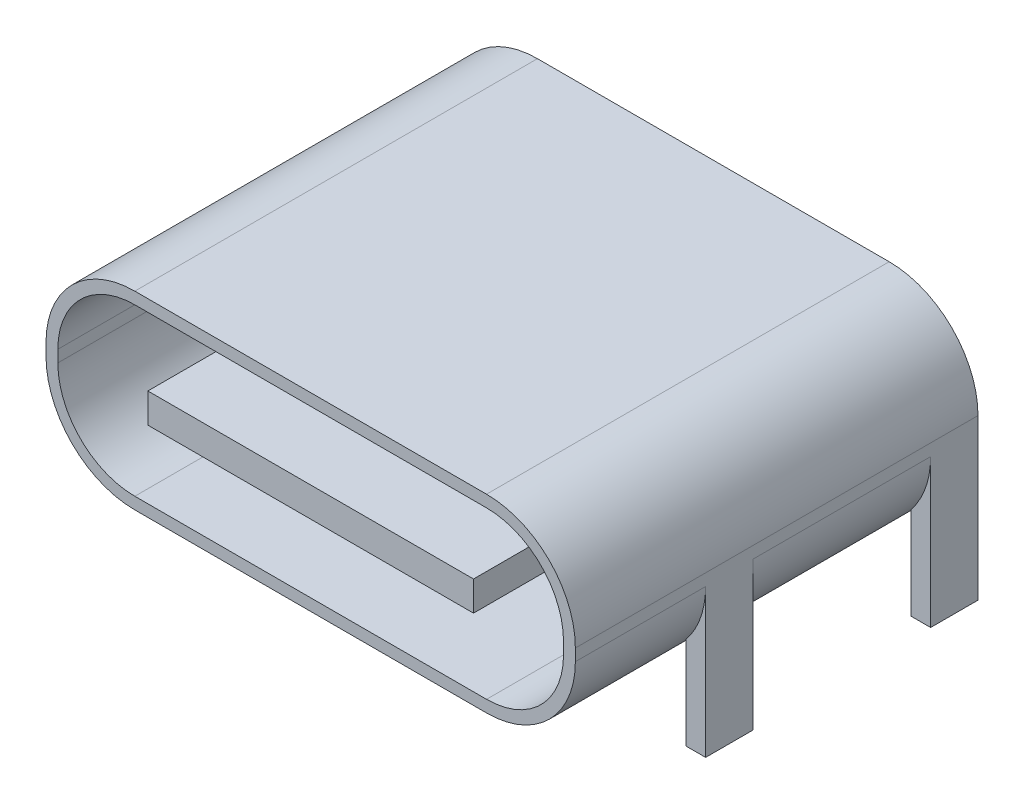
ISO-10303-21;
HEADER;
FILE_DESCRIPTION(('STEP AP214'),'2;1');
FILE_NAME('part.step','',(''),(''),'','','');
FILE_SCHEMA(('AUTOMOTIVE_DESIGN { 1 0 10303 214 1 1 1 1 }'));
ENDSEC;
DATA;
#1=APPLICATION_CONTEXT('core data for automotive mechanical design processes');
#2=APPLICATION_PROTOCOL_DEFINITION('international standard','automotive_design',2000,#1);
#3=PRODUCT_CONTEXT('',#1,'mechanical');
#4=PRODUCT('Part','Part','',(#3));
#5=PRODUCT_RELATED_PRODUCT_CATEGORY('part','',(#4));
#6=PRODUCT_DEFINITION_FORMATION('','',#4);
#7=PRODUCT_DEFINITION_CONTEXT('part definition',#1,'design');
#8=PRODUCT_DEFINITION('design','',#6,#7);
#9=PRODUCT_DEFINITION_SHAPE('','',#8);
#10=(LENGTH_UNIT() NAMED_UNIT(*) SI_UNIT(.MILLI.,.METRE.));
#11=(NAMED_UNIT(*) PLANE_ANGLE_UNIT() SI_UNIT($,.RADIAN.));
#12=(NAMED_UNIT(*) SI_UNIT($,.STERADIAN.) SOLID_ANGLE_UNIT());
#13=UNCERTAINTY_MEASURE_WITH_UNIT(LENGTH_MEASURE(1.E-05),#10,'distance_accuracy_value','');
#14=(GEOMETRIC_REPRESENTATION_CONTEXT(3) GLOBAL_UNCERTAINTY_ASSIGNED_CONTEXT((#13)) GLOBAL_UNIT_ASSIGNED_CONTEXT((#10,
#11,#12)) REPRESENTATION_CONTEXT('',''));
#15=CARTESIAN_POINT('',(0.,0.,0.));
#16=DIRECTION('',(0.,0.,1.));
#17=DIRECTION('',(1.,0.,0.));
#18=AXIS2_PLACEMENT_3D('',#15,#16,#17);
#19=CARTESIAN_POINT('',(2.97,-0.1,6.8));
#20=DIRECTION('',(0.,0.,-1.));
#21=DIRECTION('',(-1.,0.,0.));
#22=AXIS2_PLACEMENT_3D('',#19,#20,#21);
#23=CYLINDRICAL_SURFACE('',#22,1.5);
#24=CARTESIAN_POINT('',(2.97,-0.1,3.8));
#25=DIRECTION('',(0.,0.,-1.));
#26=DIRECTION('',(-1.,0.,0.));
#27=AXIS2_PLACEMENT_3D('',#24,#25,#26);
#28=CIRCLE('',#27,1.5);
#29=CARTESIAN_POINT('',(4.13488532402459,-1.0450090908939,3.8));
#30=VERTEX_POINT('',#29);
#31=CARTESIAN_POINT('',(4.47,-0.0999999999999999,3.8));
#32=VERTEX_POINT('',#31);
#33=EDGE_CURVE('E380',#30,#32,#28,.F.);
#34=ORIENTED_EDGE('',*,*,#33,.F.);
#35=DIRECTION('',(0.,0.,-1.));
#36=VECTOR('',#35,1.);
#37=CARTESIAN_POINT('',(4.13488532402459,-1.0450090908939,6.8));
#38=LINE('',#37,#36);
#39=CARTESIAN_POINT('',(4.13488532402459,-1.0450090908939,4.6));
#40=VERTEX_POINT('',#39);
#41=EDGE_CURVE('E379',#40,#30,#38,.T.);
#42=ORIENTED_EDGE('',*,*,#41,.F.);
#43=CARTESIAN_POINT('',(2.97,-0.1,4.6));
#44=DIRECTION('',(0.,0.,1.));
#45=DIRECTION('',(1.,0.,0.));
#46=AXIS2_PLACEMENT_3D('',#43,#44,#45);
#47=CIRCLE('',#46,1.5);
#48=CARTESIAN_POINT('',(4.47,-0.1,4.6));
#49=VERTEX_POINT('',#48);
#50=EDGE_CURVE('E382',#49,#40,#47,.F.);
#51=ORIENTED_EDGE('',*,*,#50,.F.);
#52=DIRECTION('',(0.,0.,-1.));
#53=VECTOR('',#52,1.);
#54=CARTESIAN_POINT('',(4.47,-0.0999999999999999,6.8));
#55=LINE('',#54,#53);
#56=CARTESIAN_POINT('',(4.47,-0.0999999999999999,6.8));
#57=VERTEX_POINT('',#56);
#58=EDGE_CURVE('E515',#57,#49,#55,.T.);
#59=ORIENTED_EDGE('',*,*,#58,.F.);
#60=CARTESIAN_POINT('',(2.97,-0.1,6.8));
#61=DIRECTION('',(0.,0.,1.));
#62=DIRECTION('',(1.,0.,0.));
#63=AXIS2_PLACEMENT_3D('',#60,#61,#62);
#64=CIRCLE('',#63,1.5);
#65=CARTESIAN_POINT('',(2.97,-1.6,6.8));
#66=VERTEX_POINT('',#65);
#67=EDGE_CURVE('E473',#66,#57,#64,.T.);
#68=ORIENTED_EDGE('',*,*,#67,.F.);
#69=DIRECTION('',(0.,0.,-1.));
#70=VECTOR('',#69,1.);
#71=CARTESIAN_POINT('',(2.97,-1.6,6.8));
#72=LINE('',#71,#70);
#73=CARTESIAN_POINT('',(2.97,-1.6,0.));
#74=VERTEX_POINT('',#73);
#75=EDGE_CURVE('E45',#66,#74,#72,.T.);
#76=ORIENTED_EDGE('',*,*,#75,.T.);
#77=CARTESIAN_POINT('',(2.97,-0.1,0.));
#78=DIRECTION('',(0.,0.,1.));
#79=DIRECTION('',(1.,0.,0.));
#80=AXIS2_PLACEMENT_3D('',#77,#78,#79);
#81=CIRCLE('',#80,1.5);
#82=CARTESIAN_POINT('',(4.13488532402459,-1.0450090908939,0.));
#83=VERTEX_POINT('',#82);
#84=EDGE_CURVE('E489',#74,#83,#81,.T.);
#85=ORIENTED_EDGE('',*,*,#84,.T.);
#86=DIRECTION('',(0.,0.,-1.));
#87=VECTOR('',#86,1.);
#88=CARTESIAN_POINT('',(4.13488532402459,-1.0450090908939,6.8));
#89=LINE('',#88,#87);
#90=CARTESIAN_POINT('',(4.13488532402459,-1.0450090908939,0.8));
#91=VERTEX_POINT('',#90);
#92=EDGE_CURVE('E406',#91,#83,#89,.T.);
#93=ORIENTED_EDGE('',*,*,#92,.F.);
#94=CARTESIAN_POINT('',(2.97,-0.1,0.8));
#95=DIRECTION('',(0.,0.,1.));
#96=DIRECTION('',(1.,0.,0.));
#97=AXIS2_PLACEMENT_3D('',#94,#95,#96);
#98=CIRCLE('',#97,1.5);
#99=CARTESIAN_POINT('',(4.47,-0.0999999999999999,0.8));
#100=VERTEX_POINT('',#99);
#101=EDGE_CURVE('E409',#100,#91,#98,.F.);
#102=ORIENTED_EDGE('',*,*,#101,.F.);
#103=EDGE_CURVE('E514',#32,#100,#55,.T.);
#104=ORIENTED_EDGE('',*,*,#103,.F.);
#105=EDGE_LOOP('',(#34,#42,#51,#59,#68,#76,#85,#93,#102,#104));
#106=FACE_BOUND('',#105,.T.);
#107=ADVANCED_FACE('F37',(#106),#23,.T.);
#108=CARTESIAN_POINT('',(-2.97,-0.1,6.8));
#109=DIRECTION('',(0.,0.,-1.));
#110=DIRECTION('',(-1.,0.,0.));
#111=AXIS2_PLACEMENT_3D('',#108,#109,#110);
#112=CYLINDRICAL_SURFACE('',#111,1.5);
#113=DIRECTION('',(0.,0.,-1.));
#114=VECTOR('',#113,1.);
#115=CARTESIAN_POINT('',(-4.13488532402459,-1.0450090908939,6.8));
#116=LINE('',#115,#114);
#117=CARTESIAN_POINT('',(-4.13488532402459,-1.0450090908939,0.));
#118=VERTEX_POINT('',#117);
#119=CARTESIAN_POINT('',(-4.13488532402459,-1.0450090908939,0.800000000000001));
#120=VERTEX_POINT('',#119);
#121=EDGE_CURVE('E430',#118,#120,#116,.F.);
#122=ORIENTED_EDGE('',*,*,#121,.F.);
#123=CARTESIAN_POINT('',(-2.97,-0.1,0.));
#124=DIRECTION('',(0.,0.,1.));
#125=DIRECTION('',(1.,0.,0.));
#126=AXIS2_PLACEMENT_3D('',#123,#124,#125);
#127=CIRCLE('',#126,1.5);
#128=CARTESIAN_POINT('',(-2.97,-1.6,0.));
#129=VERTEX_POINT('',#128);
#130=EDGE_CURVE('E466',#118,#129,#127,.T.);
#131=ORIENTED_EDGE('',*,*,#130,.T.);
#132=DIRECTION('',(0.,0.,-1.));
#133=VECTOR('',#132,1.);
#134=CARTESIAN_POINT('',(-2.97,-1.6,6.8));
#135=LINE('',#134,#133);
#136=CARTESIAN_POINT('',(-2.97,-1.6,6.8));
#137=VERTEX_POINT('',#136);
#138=EDGE_CURVE('E11',#137,#129,#135,.T.);
#139=ORIENTED_EDGE('',*,*,#138,.F.);
#140=CARTESIAN_POINT('',(-2.97,-0.1,6.8));
#141=DIRECTION('',(0.,0.,1.));
#142=DIRECTION('',(1.,0.,0.));
#143=AXIS2_PLACEMENT_3D('',#140,#141,#142);
#144=CIRCLE('',#143,1.5);
#145=CARTESIAN_POINT('',(-4.47,-0.1,6.8));
#146=VERTEX_POINT('',#145);
#147=EDGE_CURVE('E467',#146,#137,#144,.T.);
#148=ORIENTED_EDGE('',*,*,#147,.F.);
#149=DIRECTION('',(0.,0.,-1.));
#150=VECTOR('',#149,1.);
#151=CARTESIAN_POINT('',(-4.47,-0.1,6.8));
#152=LINE('',#151,#150);
#153=CARTESIAN_POINT('',(-4.47,-0.1,4.6));
#154=VERTEX_POINT('',#153);
#155=EDGE_CURVE('E500',#146,#154,#152,.T.);
#156=ORIENTED_EDGE('',*,*,#155,.T.);
#157=CARTESIAN_POINT('',(-2.97,-0.1,4.6));
#158=DIRECTION('',(0.,0.,1.));
#159=DIRECTION('',(1.,0.,0.));
#160=AXIS2_PLACEMENT_3D('',#157,#158,#159);
#161=CIRCLE('',#160,1.5);
#162=CARTESIAN_POINT('',(-4.13488532402459,-1.0450090908939,4.6));
#163=VERTEX_POINT('',#162);
#164=EDGE_CURVE('E436',#163,#154,#161,.F.);
#165=ORIENTED_EDGE('',*,*,#164,.F.);
#166=DIRECTION('',(0.,0.,-1.));
#167=VECTOR('',#166,1.);
#168=CARTESIAN_POINT('',(-4.13488532402459,-1.0450090908939,6.8));
#169=LINE('',#168,#167);
#170=CARTESIAN_POINT('',(-4.13488532402459,-1.0450090908939,3.8));
#171=VERTEX_POINT('',#170);
#172=EDGE_CURVE('E439',#171,#163,#169,.F.);
#173=ORIENTED_EDGE('',*,*,#172,.F.);
#174=CARTESIAN_POINT('',(-2.97,-0.1,3.8));
#175=DIRECTION('',(0.,0.,-1.));
#176=DIRECTION('',(-1.,0.,0.));
#177=AXIS2_PLACEMENT_3D('',#174,#175,#176);
#178=CIRCLE('',#177,1.5);
#179=CARTESIAN_POINT('',(-4.47,-0.1,3.8));
#180=VERTEX_POINT('',#179);
#181=EDGE_CURVE('E442',#180,#171,#178,.F.);
#182=ORIENTED_EDGE('',*,*,#181,.F.);
#183=CARTESIAN_POINT('',(-4.47,-0.1,0.800000000000001));
#184=VERTEX_POINT('',#183);
#185=EDGE_CURVE('E485',#180,#184,#152,.T.);
#186=ORIENTED_EDGE('',*,*,#185,.T.);
#187=CARTESIAN_POINT('',(-2.97,-0.1,0.800000000000001));
#188=DIRECTION('',(0.,0.,1.));
#189=DIRECTION('',(1.,0.,0.));
#190=AXIS2_PLACEMENT_3D('',#187,#188,#189);
#191=CIRCLE('',#190,1.5);
#192=EDGE_CURVE('E433',#120,#184,#191,.F.);
#193=ORIENTED_EDGE('',*,*,#192,.F.);
#194=EDGE_LOOP('',(#122,#131,#139,#148,#156,#165,#173,#182,#186,#193));
#195=FACE_BOUND('',#194,.T.);
#196=ADVANCED_FACE('F39',(#195),#112,.T.);
#197=CARTESIAN_POINT('',(-2.97,-1.6,6.8));
#198=DIRECTION('',(0.,1.,0.));
#199=DIRECTION('',(0.,0.,1.));
#200=AXIS2_PLACEMENT_3D('',#197,#198,#199);
#201=PLANE('',#200);
#202=DIRECTION('',(1.,0.,0.));
#203=VECTOR('',#202,1.);
#204=CARTESIAN_POINT('',(-2.97,-1.6,0.));
#205=LINE('',#204,#203);
#206=EDGE_CURVE('E487',#129,#74,#205,.T.);
#207=ORIENTED_EDGE('',*,*,#206,.T.);
#208=ORIENTED_EDGE('',*,*,#75,.F.);
#209=DIRECTION('',(1.,0.,0.));
#210=VECTOR('',#209,1.);
#211=CARTESIAN_POINT('',(-2.97,-1.6,6.8));
#212=LINE('',#211,#210);
#213=EDGE_CURVE('E470',#137,#66,#212,.T.);
#214=ORIENTED_EDGE('',*,*,#213,.F.);
#215=ORIENTED_EDGE('',*,*,#138,.T.);
#216=EDGE_LOOP('',(#207,#208,#214,#215));
#217=FACE_BOUND('',#216,.T.);
#218=ADVANCED_FACE('F565',(#217),#201,.F.);
#219=CARTESIAN_POINT('',(4.47,0.1,6.8));
#220=DIRECTION('',(-1.,0.,0.));
#221=DIRECTION('',(0.,-1.,0.));
#222=AXIS2_PLACEMENT_3D('',#219,#220,#221);
#223=PLANE('',#222);
#224=DIRECTION('',(0.,1.,0.));
#225=VECTOR('',#224,1.);
#226=CARTESIAN_POINT('',(4.47,0.1,0.));
#227=LINE('',#226,#225);
#228=CARTESIAN_POINT('',(4.47,-2.6,0.));
#229=VERTEX_POINT('',#228);
#230=CARTESIAN_POINT('',(4.47,0.1,0.));
#231=VERTEX_POINT('',#230);
#232=EDGE_CURVE('E491',#229,#231,#227,.T.);
#233=ORIENTED_EDGE('',*,*,#232,.T.);
#234=DIRECTION('',(0.,0.,-1.));
#235=VECTOR('',#234,1.);
#236=CARTESIAN_POINT('',(4.47,0.1,6.8));
#237=LINE('',#236,#235);
#238=CARTESIAN_POINT('',(4.47,0.1,6.8));
#239=VERTEX_POINT('',#238);
#240=EDGE_CURVE('E511',#239,#231,#237,.T.);
#241=ORIENTED_EDGE('',*,*,#240,.F.);
#242=DIRECTION('',(0.,1.,0.));
#243=VECTOR('',#242,1.);
#244=CARTESIAN_POINT('',(4.47,0.1,6.8));
#245=LINE('',#244,#243);
#246=EDGE_CURVE('E475',#57,#239,#245,.T.);
#247=ORIENTED_EDGE('',*,*,#246,.F.);
#248=ORIENTED_EDGE('',*,*,#58,.T.);
#249=DIRECTION('',(0.,1.,0.));
#250=VECTOR('',#249,1.);
#251=CARTESIAN_POINT('',(4.47,-2.6,4.6));
#252=LINE('',#251,#250);
#253=CARTESIAN_POINT('',(4.47,-2.6,4.6));
#254=VERTEX_POINT('',#253);
#255=EDGE_CURVE('E366',#254,#49,#252,.T.);
#256=ORIENTED_EDGE('',*,*,#255,.F.);
#257=DIRECTION('',(0.,0.,1.));
#258=VECTOR('',#257,1.);
#259=CARTESIAN_POINT('',(4.47,-2.6,4.6));
#260=LINE('',#259,#258);
#261=CARTESIAN_POINT('',(4.47,-2.6,3.8));
#262=VERTEX_POINT('',#261);
#263=EDGE_CURVE('E372',#262,#254,#260,.T.);
#264=ORIENTED_EDGE('',*,*,#263,.F.);
#265=DIRECTION('',(0.,1.,0.));
#266=VECTOR('',#265,1.);
#267=CARTESIAN_POINT('',(4.47,-2.6,3.8));
#268=LINE('',#267,#266);
#269=EDGE_CURVE('E363',#262,#32,#268,.T.);
#270=ORIENTED_EDGE('',*,*,#269,.T.);
#271=ORIENTED_EDGE('',*,*,#103,.T.);
#272=DIRECTION('',(0.,1.,0.));
#273=VECTOR('',#272,1.);
#274=CARTESIAN_POINT('',(4.47,-2.6,0.8));
#275=LINE('',#274,#273);
#276=CARTESIAN_POINT('',(4.47,-2.6,0.8));
#277=VERTEX_POINT('',#276);
#278=EDGE_CURVE('E390',#277,#100,#275,.T.);
#279=ORIENTED_EDGE('',*,*,#278,.F.);
#280=DIRECTION('',(0.,0.,1.));
#281=VECTOR('',#280,1.);
#282=CARTESIAN_POINT('',(4.47,-2.6,0.8));
#283=LINE('',#282,#281);
#284=EDGE_CURVE('E398',#229,#277,#283,.T.);
#285=ORIENTED_EDGE('',*,*,#284,.F.);
#286=EDGE_LOOP('',(#233,#241,#247,#248,#256,#264,#270,#271,#279,#285));
#287=FACE_BOUND('',#286,.T.);
#288=ADVANCED_FACE('F541',(#287),#223,.F.);
#289=CARTESIAN_POINT('',(2.97,0.1,6.8));
#290=DIRECTION('',(0.,0.,-1.));
#291=DIRECTION('',(-1.,0.,0.));
#292=AXIS2_PLACEMENT_3D('',#289,#290,#291);
#293=CYLINDRICAL_SURFACE('',#292,1.5);
#294=CARTESIAN_POINT('',(2.97,0.1,0.));
#295=DIRECTION('',(0.,0.,1.));
#296=DIRECTION('',(-1.,0.,0.));
#297=AXIS2_PLACEMENT_3D('',#294,#295,#296);
#298=CIRCLE('',#297,1.5);
#299=CARTESIAN_POINT('',(2.97,1.6,0.));
#300=VERTEX_POINT('',#299);
#301=EDGE_CURVE('E493',#231,#300,#298,.T.);
#302=ORIENTED_EDGE('',*,*,#301,.T.);
#303=DIRECTION('',(0.,0.,-1.));
#304=VECTOR('',#303,1.);
#305=CARTESIAN_POINT('',(2.97,1.6,6.8));
#306=LINE('',#305,#304);
#307=CARTESIAN_POINT('',(2.97,1.6,6.8));
#308=VERTEX_POINT('',#307);
#309=EDGE_CURVE('E508',#308,#300,#306,.T.);
#310=ORIENTED_EDGE('',*,*,#309,.F.);
#311=CARTESIAN_POINT('',(2.97,0.1,6.8));
#312=DIRECTION('',(0.,0.,1.));
#313=DIRECTION('',(-1.,0.,0.));
#314=AXIS2_PLACEMENT_3D('',#311,#312,#313);
#315=CIRCLE('',#314,1.5);
#316=EDGE_CURVE('E477',#239,#308,#315,.T.);
#317=ORIENTED_EDGE('',*,*,#316,.F.);
#318=ORIENTED_EDGE('',*,*,#240,.T.);
#319=EDGE_LOOP('',(#302,#310,#317,#318));
#320=FACE_BOUND('',#319,.T.);
#321=ADVANCED_FACE('F595',(#320),#293,.T.);
#322=CARTESIAN_POINT('',(-2.97,1.6,6.8));
#323=DIRECTION('',(0.,-1.,0.));
#324=DIRECTION('',(0.,0.,-1.));
#325=AXIS2_PLACEMENT_3D('',#322,#323,#324);
#326=PLANE('',#325);
#327=DIRECTION('',(-1.,0.,0.));
#328=VECTOR('',#327,1.);
#329=CARTESIAN_POINT('',(-2.97,1.6,0.));
#330=LINE('',#329,#328);
#331=CARTESIAN_POINT('',(-2.97,1.6,0.));
#332=VERTEX_POINT('',#331);
#333=EDGE_CURVE('E495',#300,#332,#330,.T.);
#334=ORIENTED_EDGE('',*,*,#333,.T.);
#335=DIRECTION('',(0.,0.,-1.));
#336=VECTOR('',#335,1.);
#337=CARTESIAN_POINT('',(-2.97,1.6,6.8));
#338=LINE('',#337,#336);
#339=CARTESIAN_POINT('',(-2.97,1.6,6.8));
#340=VERTEX_POINT('',#339);
#341=EDGE_CURVE('E505',#340,#332,#338,.T.);
#342=ORIENTED_EDGE('',*,*,#341,.F.);
#343=DIRECTION('',(-1.,0.,0.));
#344=VECTOR('',#343,1.);
#345=CARTESIAN_POINT('',(-2.97,1.6,6.8));
#346=LINE('',#345,#344);
#347=EDGE_CURVE('E479',#308,#340,#346,.T.);
#348=ORIENTED_EDGE('',*,*,#347,.F.);
#349=ORIENTED_EDGE('',*,*,#309,.T.);
#350=EDGE_LOOP('',(#334,#342,#348,#349));
#351=FACE_BOUND('',#350,.T.);
#352=ADVANCED_FACE('F593',(#351),#326,.F.);
#353=CARTESIAN_POINT('',(-2.97,0.1,6.8));
#354=DIRECTION('',(0.,0.,-1.));
#355=DIRECTION('',(-1.,0.,0.));
#356=AXIS2_PLACEMENT_3D('',#353,#354,#355);
#357=CYLINDRICAL_SURFACE('',#356,1.5);
#358=CARTESIAN_POINT('',(-2.97,0.1,0.));
#359=DIRECTION('',(0.,0.,1.));
#360=DIRECTION('',(1.,0.,0.));
#361=AXIS2_PLACEMENT_3D('',#358,#359,#360);
#362=CIRCLE('',#361,1.5);
#363=CARTESIAN_POINT('',(-4.47,0.0999999999999999,0.));
#364=VERTEX_POINT('',#363);
#365=EDGE_CURVE('E497',#332,#364,#362,.T.);
#366=ORIENTED_EDGE('',*,*,#365,.T.);
#367=DIRECTION('',(0.,0.,-1.));
#368=VECTOR('',#367,1.);
#369=CARTESIAN_POINT('',(-4.47,0.0999999999999999,6.8));
#370=LINE('',#369,#368);
#371=CARTESIAN_POINT('',(-4.47,0.0999999999999999,6.8));
#372=VERTEX_POINT('',#371);
#373=EDGE_CURVE('E502',#372,#364,#370,.T.);
#374=ORIENTED_EDGE('',*,*,#373,.F.);
#375=CARTESIAN_POINT('',(-2.97,0.1,6.8));
#376=DIRECTION('',(0.,0.,1.));
#377=DIRECTION('',(1.,0.,0.));
#378=AXIS2_PLACEMENT_3D('',#375,#376,#377);
#379=CIRCLE('',#378,1.5);
#380=EDGE_CURVE('E481',#340,#372,#379,.T.);
#381=ORIENTED_EDGE('',*,*,#380,.F.);
#382=ORIENTED_EDGE('',*,*,#341,.T.);
#383=EDGE_LOOP('',(#366,#374,#381,#382));
#384=FACE_BOUND('',#383,.T.);
#385=ADVANCED_FACE('F588',(#384),#357,.T.);
#386=CARTESIAN_POINT('',(-4.47,0.0999999999999999,6.8));
#387=DIRECTION('',(1.,0.,0.));
#388=DIRECTION('',(0.,0.,-1.));
#389=AXIS2_PLACEMENT_3D('',#386,#387,#388);
#390=PLANE('',#389);
#391=DIRECTION('',(0.,-1.,0.));
#392=VECTOR('',#391,1.);
#393=CARTESIAN_POINT('',(-4.47,0.0999999999999999,0.));
#394=LINE('',#393,#392);
#395=CARTESIAN_POINT('',(-4.47,-2.6,0.));
#396=VERTEX_POINT('',#395);
#397=EDGE_CURVE('E471',#364,#396,#394,.T.);
#398=ORIENTED_EDGE('',*,*,#397,.T.);
#399=DIRECTION('',(0.,0.,-1.));
#400=VECTOR('',#399,1.);
#401=CARTESIAN_POINT('',(-4.47,-2.6,0.8));
#402=LINE('',#401,#400);
#403=CARTESIAN_POINT('',(-4.47,-2.6,0.8));
#404=VERTEX_POINT('',#403);
#405=EDGE_CURVE('E427',#404,#396,#402,.T.);
#406=ORIENTED_EDGE('',*,*,#405,.F.);
#407=DIRECTION('',(0.,1.,0.));
#408=VECTOR('',#407,1.);
#409=CARTESIAN_POINT('',(-4.47,-2.6,0.8));
#410=LINE('',#409,#408);
#411=EDGE_CURVE('E418',#404,#184,#410,.T.);
#412=ORIENTED_EDGE('',*,*,#411,.T.);
#413=ORIENTED_EDGE('',*,*,#185,.F.);
#414=DIRECTION('',(0.,1.,0.));
#415=VECTOR('',#414,1.);
#416=CARTESIAN_POINT('',(-4.47,-2.6,3.8));
#417=LINE('',#416,#415);
#418=CARTESIAN_POINT('',(-4.47,-2.6,3.8));
#419=VERTEX_POINT('',#418);
#420=EDGE_CURVE('E463',#419,#180,#417,.T.);
#421=ORIENTED_EDGE('',*,*,#420,.F.);
#422=DIRECTION('',(0.,0.,-1.));
#423=VECTOR('',#422,1.);
#424=CARTESIAN_POINT('',(-4.47,-2.6,4.6));
#425=LINE('',#424,#423);
#426=CARTESIAN_POINT('',(-4.47,-2.6,4.6));
#427=VERTEX_POINT('',#426);
#428=EDGE_CURVE('E445',#427,#419,#425,.T.);
#429=ORIENTED_EDGE('',*,*,#428,.F.);
#430=DIRECTION('',(0.,1.,0.));
#431=VECTOR('',#430,1.);
#432=CARTESIAN_POINT('',(-4.47,-2.6,4.6));
#433=LINE('',#432,#431);
#434=EDGE_CURVE('E454',#427,#154,#433,.T.);
#435=ORIENTED_EDGE('',*,*,#434,.T.);
#436=ORIENTED_EDGE('',*,*,#155,.F.);
#437=DIRECTION('',(0.,-1.,0.));
#438=VECTOR('',#437,1.);
#439=CARTESIAN_POINT('',(-4.47,0.0999999999999999,6.8));
#440=LINE('',#439,#438);
#441=EDGE_CURVE('E483',#372,#146,#440,.T.);
#442=ORIENTED_EDGE('',*,*,#441,.F.);
#443=ORIENTED_EDGE('',*,*,#373,.T.);
#444=EDGE_LOOP('',(#398,#406,#412,#413,#421,#429,#435,#436,#442,#443));
#445=FACE_BOUND('',#444,.T.);
#446=ADVANCED_FACE('F581',(#445),#390,.F.);
#447=CARTESIAN_POINT('',(-2.97,-0.1,6.8));
#448=DIRECTION('',(0.,0.,1.));
#449=DIRECTION('',(1.,0.,0.));
#450=AXIS2_PLACEMENT_3D('',#447,#448,#449);
#451=PLANE('',#450);
#452=CARTESIAN_POINT('',(-2.97,-0.1,6.8));
#453=DIRECTION('',(0.,0.,1.));
#454=DIRECTION('',(1.,0.,0.));
#455=AXIS2_PLACEMENT_3D('',#452,#453,#454);
#456=CIRCLE('',#455,1.3);
#457=CARTESIAN_POINT('',(-4.27,-0.1,6.8));
#458=VERTEX_POINT('',#457);
#459=CARTESIAN_POINT('',(-2.97,-1.4,6.8));
#460=VERTEX_POINT('',#459);
#461=EDGE_CURVE('E52',#458,#460,#456,.T.);
#462=ORIENTED_EDGE('',*,*,#461,.F.);
#463=DIRECTION('',(0.,-1.,0.));
#464=VECTOR('',#463,1.);
#465=CARTESIAN_POINT('',(-4.27,0.1,6.8));
#466=LINE('',#465,#464);
#467=CARTESIAN_POINT('',(-4.27,0.1,6.8));
#468=VERTEX_POINT('',#467);
#469=EDGE_CURVE('E303',#468,#458,#466,.T.);
#470=ORIENTED_EDGE('',*,*,#469,.F.);
#471=CARTESIAN_POINT('',(-2.97,0.1,6.8));
#472=DIRECTION('',(0.,0.,1.));
#473=DIRECTION('',(1.,0.,0.));
#474=AXIS2_PLACEMENT_3D('',#471,#472,#473);
#475=CIRCLE('',#474,1.3);
#476=CARTESIAN_POINT('',(-2.97,1.4,6.8));
#477=VERTEX_POINT('',#476);
#478=EDGE_CURVE('E341',#477,#468,#475,.T.);
#479=ORIENTED_EDGE('',*,*,#478,.F.);
#480=DIRECTION('',(-1.,0.,0.));
#481=VECTOR('',#480,1.);
#482=CARTESIAN_POINT('',(2.97,1.4,6.8));
#483=LINE('',#482,#481);
#484=CARTESIAN_POINT('',(2.97,1.4,6.8));
#485=VERTEX_POINT('',#484);
#486=EDGE_CURVE('E338',#485,#477,#483,.T.);
#487=ORIENTED_EDGE('',*,*,#486,.F.);
#488=CARTESIAN_POINT('',(2.97,0.1,6.8));
#489=DIRECTION('',(0.,0.,1.));
#490=DIRECTION('',(1.,0.,0.));
#491=AXIS2_PLACEMENT_3D('',#488,#489,#490);
#492=CIRCLE('',#491,1.3);
#493=CARTESIAN_POINT('',(4.27,0.0999999999999994,6.8));
#494=VERTEX_POINT('',#493);
#495=EDGE_CURVE('E335',#494,#485,#492,.T.);
#496=ORIENTED_EDGE('',*,*,#495,.F.);
#497=DIRECTION('',(0.,1.,0.));
#498=VECTOR('',#497,1.);
#499=CARTESIAN_POINT('',(4.27,-0.1,6.8));
#500=LINE('',#499,#498);
#501=CARTESIAN_POINT('',(4.27,-0.1,6.8));
#502=VERTEX_POINT('',#501);
#503=EDGE_CURVE('E332',#502,#494,#500,.T.);
#504=ORIENTED_EDGE('',*,*,#503,.F.);
#505=CARTESIAN_POINT('',(2.97,-0.1,6.8));
#506=DIRECTION('',(0.,0.,1.));
#507=DIRECTION('',(1.,0.,0.));
#508=AXIS2_PLACEMENT_3D('',#505,#506,#507);
#509=CIRCLE('',#508,1.3);
#510=CARTESIAN_POINT('',(2.97,-1.4,6.8));
#511=VERTEX_POINT('',#510);
#512=EDGE_CURVE('E329',#511,#502,#509,.T.);
#513=ORIENTED_EDGE('',*,*,#512,.F.);
#514=DIRECTION('',(1.,0.,0.));
#515=VECTOR('',#514,1.);
#516=CARTESIAN_POINT('',(-2.97,-1.4,6.8));
#517=LINE('',#516,#515);
#518=EDGE_CURVE('E326',#460,#511,#517,.T.);
#519=ORIENTED_EDGE('',*,*,#518,.F.);
#520=EDGE_LOOP('',(#462,#470,#479,#487,#496,#504,#513,#519));
#521=FACE_BOUND('',#520,.T.);
#522=ORIENTED_EDGE('',*,*,#147,.T.);
#523=ORIENTED_EDGE('',*,*,#213,.T.);
#524=ORIENTED_EDGE('',*,*,#67,.T.);
#525=ORIENTED_EDGE('',*,*,#246,.T.);
#526=ORIENTED_EDGE('',*,*,#316,.T.);
#527=ORIENTED_EDGE('',*,*,#347,.T.);
#528=ORIENTED_EDGE('',*,*,#380,.T.);
#529=ORIENTED_EDGE('',*,*,#441,.T.);
#530=EDGE_LOOP('',(#522,#523,#524,#525,#526,#527,#528,#529));
#531=FACE_BOUND('',#530,.T.);
#532=ADVANCED_FACE('F561',(#521,#531),#451,.T.);
#533=CARTESIAN_POINT('',(-2.97,-0.1,0.));
#534=DIRECTION('',(0.,0.,1.));
#535=DIRECTION('',(1.,0.,0.));
#536=AXIS2_PLACEMENT_3D('',#533,#534,#535);
#537=PLANE('',#536);
#538=ORIENTED_EDGE('',*,*,#130,.F.);
#539=DIRECTION('',(0.,1.,0.));
#540=VECTOR('',#539,1.);
#541=CARTESIAN_POINT('',(-4.13488532402459,-2.6,0.));
#542=LINE('',#541,#540);
#543=CARTESIAN_POINT('',(-4.13488532402459,-2.6,0.));
#544=VERTEX_POINT('',#543);
#545=EDGE_CURVE('E412',#544,#118,#542,.T.);
#546=ORIENTED_EDGE('',*,*,#545,.F.);
#547=DIRECTION('',(1.,0.,0.));
#548=VECTOR('',#547,1.);
#549=CARTESIAN_POINT('',(-4.47,-2.6,0.));
#550=LINE('',#549,#548);
#551=EDGE_CURVE('E425',#396,#544,#550,.T.);
#552=ORIENTED_EDGE('',*,*,#551,.F.);
#553=ORIENTED_EDGE('',*,*,#397,.F.);
#554=ORIENTED_EDGE('',*,*,#365,.F.);
#555=ORIENTED_EDGE('',*,*,#333,.F.);
#556=ORIENTED_EDGE('',*,*,#301,.F.);
#557=ORIENTED_EDGE('',*,*,#232,.F.);
#558=DIRECTION('',(1.,0.,0.));
#559=VECTOR('',#558,1.);
#560=CARTESIAN_POINT('',(4.13488532402459,-2.6,0.));
#561=LINE('',#560,#559);
#562=CARTESIAN_POINT('',(4.13488532402459,-2.6,0.));
#563=VERTEX_POINT('',#562);
#564=EDGE_CURVE('E400',#563,#229,#561,.T.);
#565=ORIENTED_EDGE('',*,*,#564,.F.);
#566=DIRECTION('',(0.,1.,0.));
#567=VECTOR('',#566,1.);
#568=CARTESIAN_POINT('',(4.13488532402459,-2.6,0.));
#569=LINE('',#568,#567);
#570=EDGE_CURVE('E387',#563,#83,#569,.T.);
#571=ORIENTED_EDGE('',*,*,#570,.T.);
#572=ORIENTED_EDGE('',*,*,#84,.F.);
#573=ORIENTED_EDGE('',*,*,#206,.F.);
#574=EDGE_LOOP('',(#538,#546,#552,#553,#554,#555,#556,#557,#565,#571,#572,#573));
#575=FACE_BOUND('',#574,.T.);
#576=ADVANCED_FACE('F527',(#575),#537,.F.);
#577=CARTESIAN_POINT('',(-4.47,-2.6,3.8));
#578=DIRECTION('',(0.,0.,1.));
#579=DIRECTION('',(1.,0.,0.));
#580=AXIS2_PLACEMENT_3D('',#577,#578,#579);
#581=PLANE('',#580);
#582=ORIENTED_EDGE('',*,*,#420,.T.);
#583=ORIENTED_EDGE('',*,*,#181,.T.);
#584=DIRECTION('',(0.,1.,0.));
#585=VECTOR('',#584,1.);
#586=CARTESIAN_POINT('',(-4.13488532402459,-2.6,3.8));
#587=LINE('',#586,#585);
#588=CARTESIAN_POINT('',(-4.13488532402459,-2.6,3.8));
#589=VERTEX_POINT('',#588);
#590=EDGE_CURVE('E460',#589,#171,#587,.T.);
#591=ORIENTED_EDGE('',*,*,#590,.F.);
#592=DIRECTION('',(1.,0.,0.));
#593=VECTOR('',#592,1.);
#594=CARTESIAN_POINT('',(-4.47,-2.6,3.8));
#595=LINE('',#594,#593);
#596=EDGE_CURVE('E448',#419,#589,#595,.T.);
#597=ORIENTED_EDGE('',*,*,#596,.F.);
#598=EDGE_LOOP('',(#582,#583,#591,#597));
#599=FACE_BOUND('',#598,.T.);
#600=ADVANCED_FACE('F632',(#599),#581,.F.);
#601=CARTESIAN_POINT('',(-4.13488532402459,-2.6,4.6));
#602=DIRECTION('',(-1.,0.,0.));
#603=DIRECTION('',(0.,0.,1.));
#604=AXIS2_PLACEMENT_3D('',#601,#602,#603);
#605=PLANE('',#604);
#606=ORIENTED_EDGE('',*,*,#590,.T.);
#607=ORIENTED_EDGE('',*,*,#172,.T.);
#608=DIRECTION('',(0.,1.,0.));
#609=VECTOR('',#608,1.);
#610=CARTESIAN_POINT('',(-4.13488532402459,-2.6,4.6));
#611=LINE('',#610,#609);
#612=CARTESIAN_POINT('',(-4.13488532402459,-2.6,4.6));
#613=VERTEX_POINT('',#612);
#614=EDGE_CURVE('E457',#613,#163,#611,.T.);
#615=ORIENTED_EDGE('',*,*,#614,.F.);
#616=DIRECTION('',(0.,0.,1.));
#617=VECTOR('',#616,1.);
#618=CARTESIAN_POINT('',(-4.13488532402459,-2.6,4.6));
#619=LINE('',#618,#617);
#620=EDGE_CURVE('E450',#589,#613,#619,.T.);
#621=ORIENTED_EDGE('',*,*,#620,.F.);
#622=EDGE_LOOP('',(#606,#607,#615,#621));
#623=FACE_BOUND('',#622,.T.);
#624=ADVANCED_FACE('F639',(#623),#605,.F.);
#625=CARTESIAN_POINT('',(-4.47,-2.6,4.6));
#626=DIRECTION('',(0.,0.,-1.));
#627=DIRECTION('',(-1.,0.,0.));
#628=AXIS2_PLACEMENT_3D('',#625,#626,#627);
#629=PLANE('',#628);
#630=ORIENTED_EDGE('',*,*,#614,.T.);
#631=ORIENTED_EDGE('',*,*,#164,.T.);
#632=ORIENTED_EDGE('',*,*,#434,.F.);
#633=DIRECTION('',(-1.,0.,0.));
#634=VECTOR('',#633,1.);
#635=CARTESIAN_POINT('',(-4.47,-2.6,4.6));
#636=LINE('',#635,#634);
#637=EDGE_CURVE('E452',#613,#427,#636,.T.);
#638=ORIENTED_EDGE('',*,*,#637,.F.);
#639=EDGE_LOOP('',(#630,#631,#632,#638));
#640=FACE_BOUND('',#639,.T.);
#641=ADVANCED_FACE('F643',(#640),#629,.F.);
#642=CARTESIAN_POINT('',(0.,-2.6,0.));
#643=DIRECTION('',(0.,-1.,0.));
#644=DIRECTION('',(0.,0.,-1.));
#645=AXIS2_PLACEMENT_3D('',#642,#643,#644);
#646=PLANE('',#645);
#647=ORIENTED_EDGE('',*,*,#428,.T.);
#648=ORIENTED_EDGE('',*,*,#596,.T.);
#649=ORIENTED_EDGE('',*,*,#620,.T.);
#650=ORIENTED_EDGE('',*,*,#637,.T.);
#651=EDGE_LOOP('',(#647,#648,#649,#650));
#652=FACE_BOUND('',#651,.T.);
#653=ADVANCED_FACE('F647',(#652),#646,.T.);
#654=CARTESIAN_POINT('',(-4.13488532402459,-2.6,0.8));
#655=DIRECTION('',(-1.,0.,0.));
#656=DIRECTION('',(0.,0.,1.));
#657=AXIS2_PLACEMENT_3D('',#654,#655,#656);
#658=PLANE('',#657);
#659=ORIENTED_EDGE('',*,*,#545,.T.);
#660=ORIENTED_EDGE('',*,*,#121,.T.);
#661=DIRECTION('',(0.,1.,0.));
#662=VECTOR('',#661,1.);
#663=CARTESIAN_POINT('',(-4.13488532402459,-2.6,0.8));
#664=LINE('',#663,#662);
#665=CARTESIAN_POINT('',(-4.13488532402459,-2.6,0.8));
#666=VERTEX_POINT('',#665);
#667=EDGE_CURVE('E415',#666,#120,#664,.T.);
#668=ORIENTED_EDGE('',*,*,#667,.F.);
#669=DIRECTION('',(0.,0.,1.));
#670=VECTOR('',#669,1.);
#671=CARTESIAN_POINT('',(-4.13488532402459,-2.6,0.8));
#672=LINE('',#671,#670);
#673=EDGE_CURVE('E423',#544,#666,#672,.T.);
#674=ORIENTED_EDGE('',*,*,#673,.F.);
#675=EDGE_LOOP('',(#659,#660,#668,#674));
#676=FACE_BOUND('',#675,.T.);
#677=ADVANCED_FACE('F574',(#676),#658,.F.);
#678=CARTESIAN_POINT('',(-4.47,-2.6,0.8));
#679=DIRECTION('',(0.,0.,-1.));
#680=DIRECTION('',(-1.,0.,0.));
#681=AXIS2_PLACEMENT_3D('',#678,#679,#680);
#682=PLANE('',#681);
#683=ORIENTED_EDGE('',*,*,#667,.T.);
#684=ORIENTED_EDGE('',*,*,#192,.T.);
#685=ORIENTED_EDGE('',*,*,#411,.F.);
#686=DIRECTION('',(-1.,0.,0.));
#687=VECTOR('',#686,1.);
#688=CARTESIAN_POINT('',(-4.47,-2.6,0.8));
#689=LINE('',#688,#687);
#690=EDGE_CURVE('E421',#666,#404,#689,.T.);
#691=ORIENTED_EDGE('',*,*,#690,.F.);
#692=EDGE_LOOP('',(#683,#684,#685,#691));
#693=FACE_BOUND('',#692,.T.);
#694=ADVANCED_FACE('F654',(#693),#682,.F.);
#695=CARTESIAN_POINT('',(0.,-2.6,0.));
#696=DIRECTION('',(0.,-1.,0.));
#697=DIRECTION('',(0.,0.,-1.));
#698=AXIS2_PLACEMENT_3D('',#695,#696,#697);
#699=PLANE('',#698);
#700=ORIENTED_EDGE('',*,*,#405,.T.);
#701=ORIENTED_EDGE('',*,*,#551,.T.);
#702=ORIENTED_EDGE('',*,*,#673,.T.);
#703=ORIENTED_EDGE('',*,*,#690,.T.);
#704=EDGE_LOOP('',(#700,#701,#702,#703));
#705=FACE_BOUND('',#704,.T.);
#706=ADVANCED_FACE('F577',(#705),#699,.T.);
#707=CARTESIAN_POINT('',(4.13488532402459,-2.6,0.8));
#708=DIRECTION('',(1.,0.,0.));
#709=DIRECTION('',(0.,0.,-1.));
#710=AXIS2_PLACEMENT_3D('',#707,#708,#709);
#711=PLANE('',#710);
#712=DIRECTION('',(0.,1.,0.));
#713=VECTOR('',#712,1.);
#714=CARTESIAN_POINT('',(4.13488532402459,-2.6,0.8));
#715=LINE('',#714,#713);
#716=CARTESIAN_POINT('',(4.13488532402459,-2.6,0.8));
#717=VERTEX_POINT('',#716);
#718=EDGE_CURVE('E393',#717,#91,#715,.T.);
#719=ORIENTED_EDGE('',*,*,#718,.T.);
#720=ORIENTED_EDGE('',*,*,#92,.T.);
#721=ORIENTED_EDGE('',*,*,#570,.F.);
#722=DIRECTION('',(0.,0.,-1.));
#723=VECTOR('',#722,1.);
#724=CARTESIAN_POINT('',(4.13488532402459,-2.6,0.8));
#725=LINE('',#724,#723);
#726=EDGE_CURVE('E403',#717,#563,#725,.T.);
#727=ORIENTED_EDGE('',*,*,#726,.F.);
#728=EDGE_LOOP('',(#719,#720,#721,#727));
#729=FACE_BOUND('',#728,.T.);
#730=ADVANCED_FACE('F531',(#729),#711,.F.);
#731=CARTESIAN_POINT('',(4.13488532402459,-2.6,0.8));
#732=DIRECTION('',(0.,0.,-1.));
#733=DIRECTION('',(-1.,0.,0.));
#734=AXIS2_PLACEMENT_3D('',#731,#732,#733);
#735=PLANE('',#734);
#736=ORIENTED_EDGE('',*,*,#278,.T.);
#737=ORIENTED_EDGE('',*,*,#101,.T.);
#738=ORIENTED_EDGE('',*,*,#718,.F.);
#739=DIRECTION('',(-1.,0.,0.));
#740=VECTOR('',#739,1.);
#741=CARTESIAN_POINT('',(4.13488532402459,-2.6,0.8));
#742=LINE('',#741,#740);
#743=EDGE_CURVE('E396',#277,#717,#742,.T.);
#744=ORIENTED_EDGE('',*,*,#743,.F.);
#745=EDGE_LOOP('',(#736,#737,#738,#744));
#746=FACE_BOUND('',#745,.T.);
#747=ADVANCED_FACE('F538',(#746),#735,.F.);
#748=CARTESIAN_POINT('',(0.,-2.6,0.));
#749=DIRECTION('',(0.,-1.,0.));
#750=DIRECTION('',(0.,0.,-1.));
#751=AXIS2_PLACEMENT_3D('',#748,#749,#750);
#752=PLANE('',#751);
#753=ORIENTED_EDGE('',*,*,#726,.T.);
#754=ORIENTED_EDGE('',*,*,#564,.T.);
#755=ORIENTED_EDGE('',*,*,#284,.T.);
#756=ORIENTED_EDGE('',*,*,#743,.T.);
#757=EDGE_LOOP('',(#753,#754,#755,#756));
#758=FACE_BOUND('',#757,.T.);
#759=ADVANCED_FACE('F597',(#758),#752,.T.);
#760=CARTESIAN_POINT('',(4.13488532402459,-2.6,4.6));
#761=DIRECTION('',(1.,0.,0.));
#762=DIRECTION('',(0.,0.,-1.));
#763=AXIS2_PLACEMENT_3D('',#760,#761,#762);
#764=PLANE('',#763);
#765=DIRECTION('',(0.,1.,0.));
#766=VECTOR('',#765,1.);
#767=CARTESIAN_POINT('',(4.13488532402459,-2.6,4.6));
#768=LINE('',#767,#766);
#769=CARTESIAN_POINT('',(4.13488532402459,-2.6,4.6));
#770=VERTEX_POINT('',#769);
#771=EDGE_CURVE('E368',#770,#40,#768,.T.);
#772=ORIENTED_EDGE('',*,*,#771,.T.);
#773=ORIENTED_EDGE('',*,*,#41,.T.);
#774=DIRECTION('',(0.,1.,0.));
#775=VECTOR('',#774,1.);
#776=CARTESIAN_POINT('',(4.13488532402459,-2.6,3.8));
#777=LINE('',#776,#775);
#778=CARTESIAN_POINT('',(4.13488532402459,-2.6,3.8));
#779=VERTEX_POINT('',#778);
#780=EDGE_CURVE('E348',#779,#30,#777,.T.);
#781=ORIENTED_EDGE('',*,*,#780,.F.);
#782=DIRECTION('',(0.,0.,-1.));
#783=VECTOR('',#782,1.);
#784=CARTESIAN_POINT('',(4.13488532402459,-2.6,4.6));
#785=LINE('',#784,#783);
#786=EDGE_CURVE('E376',#770,#779,#785,.T.);
#787=ORIENTED_EDGE('',*,*,#786,.F.);
#788=EDGE_LOOP('',(#772,#773,#781,#787));
#789=FACE_BOUND('',#788,.T.);
#790=ADVANCED_FACE('F551',(#789),#764,.F.);
#791=CARTESIAN_POINT('',(4.13488532402459,-2.6,3.8));
#792=DIRECTION('',(0.,0.,1.));
#793=DIRECTION('',(1.,0.,0.));
#794=AXIS2_PLACEMENT_3D('',#791,#792,#793);
#795=PLANE('',#794);
#796=ORIENTED_EDGE('',*,*,#780,.T.);
#797=ORIENTED_EDGE('',*,*,#33,.T.);
#798=ORIENTED_EDGE('',*,*,#269,.F.);
#799=DIRECTION('',(1.,0.,0.));
#800=VECTOR('',#799,1.);
#801=CARTESIAN_POINT('',(4.13488532402459,-2.6,3.8));
#802=LINE('',#801,#800);
#803=EDGE_CURVE('E374',#779,#262,#802,.T.);
#804=ORIENTED_EDGE('',*,*,#803,.F.);
#805=EDGE_LOOP('',(#796,#797,#798,#804));
#806=FACE_BOUND('',#805,.T.);
#807=ADVANCED_FACE('F546',(#806),#795,.F.);
#808=CARTESIAN_POINT('',(4.13488532402459,-2.6,4.6));
#809=DIRECTION('',(0.,0.,-1.));
#810=DIRECTION('',(-1.,0.,0.));
#811=AXIS2_PLACEMENT_3D('',#808,#809,#810);
#812=PLANE('',#811);
#813=ORIENTED_EDGE('',*,*,#255,.T.);
#814=ORIENTED_EDGE('',*,*,#50,.T.);
#815=ORIENTED_EDGE('',*,*,#771,.F.);
#816=DIRECTION('',(-1.,0.,0.));
#817=VECTOR('',#816,1.);
#818=CARTESIAN_POINT('',(4.13488532402459,-2.6,4.6));
#819=LINE('',#818,#817);
#820=EDGE_CURVE('E370',#254,#770,#819,.T.);
#821=ORIENTED_EDGE('',*,*,#820,.F.);
#822=EDGE_LOOP('',(#813,#814,#815,#821));
#823=FACE_BOUND('',#822,.T.);
#824=ADVANCED_FACE('F556',(#823),#812,.F.);
#825=CARTESIAN_POINT('',(0.,-2.6,0.));
#826=DIRECTION('',(0.,-1.,0.));
#827=DIRECTION('',(0.,0.,-1.));
#828=AXIS2_PLACEMENT_3D('',#825,#826,#827);
#829=PLANE('',#828);
#830=ORIENTED_EDGE('',*,*,#786,.T.);
#831=ORIENTED_EDGE('',*,*,#803,.T.);
#832=ORIENTED_EDGE('',*,*,#263,.T.);
#833=ORIENTED_EDGE('',*,*,#820,.T.);
#834=EDGE_LOOP('',(#830,#831,#832,#833));
#835=FACE_BOUND('',#834,.T.);
#836=ADVANCED_FACE('F711',(#835),#829,.T.);
#837=CARTESIAN_POINT('',(-2.97,-0.1,1.8));
#838=DIRECTION('',(0.,0.,1.));
#839=DIRECTION('',(1.,0.,0.));
#840=AXIS2_PLACEMENT_3D('',#837,#838,#839);
#841=CYLINDRICAL_SURFACE('',#840,1.3);
#842=ORIENTED_EDGE('',*,*,#461,.T.);
#843=DIRECTION('',(0.,0.,1.));
#844=VECTOR('',#843,1.);
#845=CARTESIAN_POINT('',(-2.97,-1.4,1.8));
#846=LINE('',#845,#844);
#847=CARTESIAN_POINT('',(-2.97,-1.4,1.8));
#848=VERTEX_POINT('',#847);
#849=EDGE_CURVE('E324',#848,#460,#846,.T.);
#850=ORIENTED_EDGE('',*,*,#849,.F.);
#851=CARTESIAN_POINT('',(-2.97,-0.1,1.8));
#852=DIRECTION('',(0.,0.,1.));
#853=DIRECTION('',(1.,0.,0.));
#854=AXIS2_PLACEMENT_3D('',#851,#852,#853);
#855=CIRCLE('',#854,1.3);
#856=CARTESIAN_POINT('',(-4.27,-0.1,1.8));
#857=VERTEX_POINT('',#856);
#858=EDGE_CURVE('E299',#857,#848,#855,.T.);
#859=ORIENTED_EDGE('',*,*,#858,.F.);
#860=DIRECTION('',(0.,0.,1.));
#861=VECTOR('',#860,1.);
#862=CARTESIAN_POINT('',(-4.27,-0.1,1.8));
#863=LINE('',#862,#861);
#864=EDGE_CURVE('E346',#857,#458,#863,.T.);
#865=ORIENTED_EDGE('',*,*,#864,.T.);
#866=EDGE_LOOP('',(#842,#850,#859,#865));
#867=FACE_BOUND('',#866,.T.);
#868=ADVANCED_FACE('F721',(#867),#841,.F.);
#869=CARTESIAN_POINT('',(-4.27,0.1,1.8));
#870=DIRECTION('',(-1.,0.,0.));
#871=DIRECTION('',(0.,0.,1.));
#872=AXIS2_PLACEMENT_3D('',#869,#870,#871);
#873=PLANE('',#872);
#874=ORIENTED_EDGE('',*,*,#469,.T.);
#875=ORIENTED_EDGE('',*,*,#864,.F.);
#876=DIRECTION('',(0.,-1.,0.));
#877=VECTOR('',#876,1.);
#878=CARTESIAN_POINT('',(-4.27,0.1,1.8));
#879=LINE('',#878,#877);
#880=CARTESIAN_POINT('',(-4.27,0.1,1.8));
#881=VERTEX_POINT('',#880);
#882=EDGE_CURVE('E321',#881,#857,#879,.T.);
#883=ORIENTED_EDGE('',*,*,#882,.F.);
#884=DIRECTION('',(0.,0.,1.));
#885=VECTOR('',#884,1.);
#886=CARTESIAN_POINT('',(-4.27,0.1,1.8));
#887=LINE('',#886,#885);
#888=EDGE_CURVE('E349',#881,#468,#887,.T.);
#889=ORIENTED_EDGE('',*,*,#888,.T.);
#890=EDGE_LOOP('',(#874,#875,#883,#889));
#891=FACE_BOUND('',#890,.T.);
#892=ADVANCED_FACE('F742',(#891),#873,.F.);
#893=CARTESIAN_POINT('',(-2.97,0.1,1.8));
#894=DIRECTION('',(0.,0.,1.));
#895=DIRECTION('',(1.,0.,0.));
#896=AXIS2_PLACEMENT_3D('',#893,#894,#895);
#897=CYLINDRICAL_SURFACE('',#896,1.3);
#898=ORIENTED_EDGE('',*,*,#478,.T.);
#899=ORIENTED_EDGE('',*,*,#888,.F.);
#900=CARTESIAN_POINT('',(-2.97,0.1,1.8));
#901=DIRECTION('',(0.,0.,1.));
#902=DIRECTION('',(1.,0.,0.));
#903=AXIS2_PLACEMENT_3D('',#900,#901,#902);
#904=CIRCLE('',#903,1.3);
#905=CARTESIAN_POINT('',(-2.97,1.4,1.8));
#906=VERTEX_POINT('',#905);
#907=EDGE_CURVE('E318',#906,#881,#904,.T.);
#908=ORIENTED_EDGE('',*,*,#907,.F.);
#909=DIRECTION('',(0.,0.,1.));
#910=VECTOR('',#909,1.);
#911=CARTESIAN_POINT('',(-2.97,1.4,1.8));
#912=LINE('',#911,#910);
#913=EDGE_CURVE('E351',#906,#477,#912,.T.);
#914=ORIENTED_EDGE('',*,*,#913,.T.);
#915=EDGE_LOOP('',(#898,#899,#908,#914));
#916=FACE_BOUND('',#915,.T.);
#917=ADVANCED_FACE('F752',(#916),#897,.F.);
#918=CARTESIAN_POINT('',(2.97,1.4,1.8));
#919=DIRECTION('',(0.,1.,0.));
#920=DIRECTION('',(-1.,0.,0.));
#921=AXIS2_PLACEMENT_3D('',#918,#919,#920);
#922=PLANE('',#921);
#923=ORIENTED_EDGE('',*,*,#486,.T.);
#924=ORIENTED_EDGE('',*,*,#913,.F.);
#925=DIRECTION('',(-1.,0.,0.));
#926=VECTOR('',#925,1.);
#927=CARTESIAN_POINT('',(2.97,1.4,1.8));
#928=LINE('',#927,#926);
#929=CARTESIAN_POINT('',(2.97,1.4,1.8));
#930=VERTEX_POINT('',#929);
#931=EDGE_CURVE('E315',#930,#906,#928,.T.);
#932=ORIENTED_EDGE('',*,*,#931,.F.);
#933=DIRECTION('',(0.,0.,1.));
#934=VECTOR('',#933,1.);
#935=CARTESIAN_POINT('',(2.97,1.4,1.8));
#936=LINE('',#935,#934);
#937=EDGE_CURVE('E353',#930,#485,#936,.T.);
#938=ORIENTED_EDGE('',*,*,#937,.T.);
#939=EDGE_LOOP('',(#923,#924,#932,#938));
#940=FACE_BOUND('',#939,.T.);
#941=ADVANCED_FACE('F763',(#940),#922,.F.);
#942=CARTESIAN_POINT('',(2.97,0.1,1.8));
#943=DIRECTION('',(0.,0.,1.));
#944=DIRECTION('',(1.,0.,0.));
#945=AXIS2_PLACEMENT_3D('',#942,#943,#944);
#946=CYLINDRICAL_SURFACE('',#945,1.3);
#947=ORIENTED_EDGE('',*,*,#495,.T.);
#948=ORIENTED_EDGE('',*,*,#937,.F.);
#949=CARTESIAN_POINT('',(2.97,0.1,1.8));
#950=DIRECTION('',(0.,0.,1.));
#951=DIRECTION('',(1.,0.,0.));
#952=AXIS2_PLACEMENT_3D('',#949,#950,#951);
#953=CIRCLE('',#952,1.3);
#954=CARTESIAN_POINT('',(4.27,0.0999999999999994,1.8));
#955=VERTEX_POINT('',#954);
#956=EDGE_CURVE('E312',#955,#930,#953,.T.);
#957=ORIENTED_EDGE('',*,*,#956,.F.);
#958=DIRECTION('',(0.,0.,1.));
#959=VECTOR('',#958,1.);
#960=CARTESIAN_POINT('',(4.27,0.0999999999999994,1.8));
#961=LINE('',#960,#959);
#962=EDGE_CURVE('E355',#955,#494,#961,.T.);
#963=ORIENTED_EDGE('',*,*,#962,.T.);
#964=EDGE_LOOP('',(#947,#948,#957,#963));
#965=FACE_BOUND('',#964,.T.);
#966=ADVANCED_FACE('F774',(#965),#946,.F.);
#967=CARTESIAN_POINT('',(4.27,-0.1,1.8));
#968=DIRECTION('',(1.,0.,0.));
#969=DIRECTION('',(0.,1.,0.));
#970=AXIS2_PLACEMENT_3D('',#967,#968,#969);
#971=PLANE('',#970);
#972=ORIENTED_EDGE('',*,*,#503,.T.);
#973=ORIENTED_EDGE('',*,*,#962,.F.);
#974=DIRECTION('',(0.,1.,0.));
#975=VECTOR('',#974,1.);
#976=CARTESIAN_POINT('',(4.27,-0.1,1.8));
#977=LINE('',#976,#975);
#978=CARTESIAN_POINT('',(4.27,-0.1,1.8));
#979=VERTEX_POINT('',#978);
#980=EDGE_CURVE('E309',#979,#955,#977,.T.);
#981=ORIENTED_EDGE('',*,*,#980,.F.);
#982=DIRECTION('',(0.,0.,1.));
#983=VECTOR('',#982,1.);
#984=CARTESIAN_POINT('',(4.27,-0.1,1.8));
#985=LINE('',#984,#983);
#986=EDGE_CURVE('E357',#979,#502,#985,.T.);
#987=ORIENTED_EDGE('',*,*,#986,.T.);
#988=EDGE_LOOP('',(#972,#973,#981,#987));
#989=FACE_BOUND('',#988,.T.);
#990=ADVANCED_FACE('F785',(#989),#971,.F.);
#991=CARTESIAN_POINT('',(2.97,-0.1,1.8));
#992=DIRECTION('',(0.,0.,1.));
#993=DIRECTION('',(1.,0.,0.));
#994=AXIS2_PLACEMENT_3D('',#991,#992,#993);
#995=CYLINDRICAL_SURFACE('',#994,1.3);
#996=ORIENTED_EDGE('',*,*,#512,.T.);
#997=ORIENTED_EDGE('',*,*,#986,.F.);
#998=CARTESIAN_POINT('',(2.97,-0.1,1.8));
#999=DIRECTION('',(0.,0.,1.));
#1000=DIRECTION('',(1.,0.,0.));
#1001=AXIS2_PLACEMENT_3D('',#998,#999,#1000);
#1002=CIRCLE('',#1001,1.3);
#1003=CARTESIAN_POINT('',(2.97,-1.4,1.8));
#1004=VERTEX_POINT('',#1003);
#1005=EDGE_CURVE('E306',#1004,#979,#1002,.T.);
#1006=ORIENTED_EDGE('',*,*,#1005,.F.);
#1007=DIRECTION('',(0.,0.,1.));
#1008=VECTOR('',#1007,1.);
#1009=CARTESIAN_POINT('',(2.97,-1.4,1.8));
#1010=LINE('',#1009,#1008);
#1011=EDGE_CURVE('E359',#1004,#511,#1010,.T.);
#1012=ORIENTED_EDGE('',*,*,#1011,.T.);
#1013=EDGE_LOOP('',(#996,#997,#1006,#1012));
#1014=FACE_BOUND('',#1013,.T.);
#1015=ADVANCED_FACE('F796',(#1014),#995,.F.);
#1016=CARTESIAN_POINT('',(-2.97,-1.4,1.8));
#1017=DIRECTION('',(0.,-1.,0.));
#1018=DIRECTION('',(0.,0.,-1.));
#1019=AXIS2_PLACEMENT_3D('',#1016,#1017,#1018);
#1020=PLANE('',#1019);
#1021=ORIENTED_EDGE('',*,*,#518,.T.);
#1022=ORIENTED_EDGE('',*,*,#1011,.F.);
#1023=DIRECTION('',(1.,0.,0.));
#1024=VECTOR('',#1023,1.);
#1025=CARTESIAN_POINT('',(-2.97,-1.4,1.8));
#1026=LINE('',#1025,#1024);
#1027=EDGE_CURVE('E302',#848,#1004,#1026,.T.);
#1028=ORIENTED_EDGE('',*,*,#1027,.F.);
#1029=ORIENTED_EDGE('',*,*,#849,.T.);
#1030=EDGE_LOOP('',(#1021,#1022,#1028,#1029));
#1031=FACE_BOUND('',#1030,.T.);
#1032=ADVANCED_FACE('F807',(#1031),#1020,.F.);
#1033=CARTESIAN_POINT('',(-2.97,-0.1,1.8));
#1034=DIRECTION('',(0.,0.,1.));
#1035=DIRECTION('',(1.,0.,0.));
#1036=AXIS2_PLACEMENT_3D('',#1033,#1034,#1035);
#1037=PLANE('',#1036);
#1038=DIRECTION('',(1.,0.,0.));
#1039=VECTOR('',#1038,1.);
#1040=CARTESIAN_POINT('',(-2.75,-0.25,1.8));
#1041=LINE('',#1040,#1039);
#1042=CARTESIAN_POINT('',(-2.75,-0.25,1.8));
#1043=VERTEX_POINT('',#1042);
#1044=CARTESIAN_POINT('',(2.75,-0.25,1.8));
#1045=VERTEX_POINT('',#1044);
#1046=EDGE_CURVE('E270',#1043,#1045,#1041,.T.);
#1047=ORIENTED_EDGE('',*,*,#1046,.F.);
#1048=DIRECTION('',(0.,-1.,0.));
#1049=VECTOR('',#1048,1.);
#1050=CARTESIAN_POINT('',(-2.75,0.25,1.8));
#1051=LINE('',#1050,#1049);
#1052=CARTESIAN_POINT('',(-2.75,0.25,1.8));
#1053=VERTEX_POINT('',#1052);
#1054=EDGE_CURVE('E280',#1053,#1043,#1051,.T.);
#1055=ORIENTED_EDGE('',*,*,#1054,.F.);
#1056=DIRECTION('',(-1.,0.,0.));
#1057=VECTOR('',#1056,1.);
#1058=CARTESIAN_POINT('',(-2.75,0.25,1.8));
#1059=LINE('',#1058,#1057);
#1060=CARTESIAN_POINT('',(2.75,0.25,1.8));
#1061=VERTEX_POINT('',#1060);
#1062=EDGE_CURVE('E262',#1061,#1053,#1059,.T.);
#1063=ORIENTED_EDGE('',*,*,#1062,.F.);
#1064=DIRECTION('',(0.,1.,0.));
#1065=VECTOR('',#1064,1.);
#1066=CARTESIAN_POINT('',(2.75,0.25,1.8));
#1067=LINE('',#1066,#1065);
#1068=EDGE_CURVE('E277',#1045,#1061,#1067,.T.);
#1069=ORIENTED_EDGE('',*,*,#1068,.F.);
#1070=EDGE_LOOP('',(#1047,#1055,#1063,#1069));
#1071=FACE_BOUND('',#1070,.T.);
#1072=ORIENTED_EDGE('',*,*,#858,.T.);
#1073=ORIENTED_EDGE('',*,*,#1027,.T.);
#1074=ORIENTED_EDGE('',*,*,#1005,.T.);
#1075=ORIENTED_EDGE('',*,*,#980,.T.);
#1076=ORIENTED_EDGE('',*,*,#956,.T.);
#1077=ORIENTED_EDGE('',*,*,#931,.T.);
#1078=ORIENTED_EDGE('',*,*,#907,.T.);
#1079=ORIENTED_EDGE('',*,*,#882,.T.);
#1080=EDGE_LOOP('',(#1072,#1073,#1074,#1075,#1076,#1077,#1078,#1079));
#1081=FACE_BOUND('',#1080,.T.);
#1082=ADVANCED_FACE('F275',(#1071,#1081),#1037,.T.);
#1083=CARTESIAN_POINT('',(2.75,0.25,1.8));
#1084=DIRECTION('',(1.,0.,0.));
#1085=DIRECTION('',(0.,0.,-1.));
#1086=AXIS2_PLACEMENT_3D('',#1083,#1084,#1085);
#1087=PLANE('',#1086);
#1088=DIRECTION('',(0.,1.,0.));
#1089=VECTOR('',#1088,1.);
#1090=CARTESIAN_POINT('',(2.75,0.25,6.8));
#1091=LINE('',#1090,#1089);
#1092=CARTESIAN_POINT('',(2.75,-0.25,6.8));
#1093=VERTEX_POINT('',#1092);
#1094=CARTESIAN_POINT('',(2.75,0.25,6.8));
#1095=VERTEX_POINT('',#1094);
#1096=EDGE_CURVE('E291',#1093,#1095,#1091,.T.);
#1097=ORIENTED_EDGE('',*,*,#1096,.F.);
#1098=DIRECTION('',(0.,0.,1.));
#1099=VECTOR('',#1098,1.);
#1100=CARTESIAN_POINT('',(2.75,-0.25,1.8));
#1101=LINE('',#1100,#1099);
#1102=EDGE_CURVE('E283',#1045,#1093,#1101,.T.);
#1103=ORIENTED_EDGE('',*,*,#1102,.F.);
#1104=ORIENTED_EDGE('',*,*,#1068,.T.);
#1105=DIRECTION('',(0.,0.,1.));
#1106=VECTOR('',#1105,1.);
#1107=CARTESIAN_POINT('',(2.75,0.25,1.8));
#1108=LINE('',#1107,#1106);
#1109=EDGE_CURVE('E259',#1061,#1095,#1108,.T.);
#1110=ORIENTED_EDGE('',*,*,#1109,.T.);
#1111=EDGE_LOOP('',(#1097,#1103,#1104,#1110));
#1112=FACE_BOUND('',#1111,.T.);
#1113=ADVANCED_FACE('F282',(#1112),#1087,.T.);
#1114=CARTESIAN_POINT('',(-2.75,-0.25,1.8));
#1115=DIRECTION('',(0.,-1.,0.));
#1116=DIRECTION('',(0.,0.,-1.));
#1117=AXIS2_PLACEMENT_3D('',#1114,#1115,#1116);
#1118=PLANE('',#1117);
#1119=DIRECTION('',(1.,0.,0.));
#1120=VECTOR('',#1119,1.);
#1121=CARTESIAN_POINT('',(-2.75,-0.25,6.8));
#1122=LINE('',#1121,#1120);
#1123=CARTESIAN_POINT('',(-2.75,-0.25,6.8));
#1124=VERTEX_POINT('',#1123);
#1125=EDGE_CURVE('E284',#1124,#1093,#1122,.T.);
#1126=ORIENTED_EDGE('',*,*,#1125,.F.);
#1127=DIRECTION('',(0.,0.,1.));
#1128=VECTOR('',#1127,1.);
#1129=CARTESIAN_POINT('',(-2.75,-0.25,1.8));
#1130=LINE('',#1129,#1128);
#1131=EDGE_CURVE('E296',#1043,#1124,#1130,.T.);
#1132=ORIENTED_EDGE('',*,*,#1131,.F.);
#1133=ORIENTED_EDGE('',*,*,#1046,.T.);
#1134=ORIENTED_EDGE('',*,*,#1102,.T.);
#1135=EDGE_LOOP('',(#1126,#1132,#1133,#1134));
#1136=FACE_BOUND('',#1135,.T.);
#1137=ADVANCED_FACE('F837',(#1136),#1118,.T.);
#1138=CARTESIAN_POINT('',(-2.75,0.25,1.8));
#1139=DIRECTION('',(-1.,0.,0.));
#1140=DIRECTION('',(0.,0.,1.));
#1141=AXIS2_PLACEMENT_3D('',#1138,#1139,#1140);
#1142=PLANE('',#1141);
#1143=DIRECTION('',(0.,-1.,0.));
#1144=VECTOR('',#1143,1.);
#1145=CARTESIAN_POINT('',(-2.75,0.25,6.8));
#1146=LINE('',#1145,#1144);
#1147=CARTESIAN_POINT('',(-2.75,0.25,6.8));
#1148=VERTEX_POINT('',#1147);
#1149=EDGE_CURVE('E60',#1148,#1124,#1146,.T.);
#1150=ORIENTED_EDGE('',*,*,#1149,.F.);
#1151=DIRECTION('',(0.,0.,1.));
#1152=VECTOR('',#1151,1.);
#1153=CARTESIAN_POINT('',(-2.75,0.25,1.8));
#1154=LINE('',#1153,#1152);
#1155=EDGE_CURVE('E269',#1053,#1148,#1154,.T.);
#1156=ORIENTED_EDGE('',*,*,#1155,.F.);
#1157=ORIENTED_EDGE('',*,*,#1054,.T.);
#1158=ORIENTED_EDGE('',*,*,#1131,.T.);
#1159=EDGE_LOOP('',(#1150,#1156,#1157,#1158));
#1160=FACE_BOUND('',#1159,.T.);
#1161=ADVANCED_FACE('F847',(#1160),#1142,.T.);
#1162=CARTESIAN_POINT('',(-2.75,0.25,1.8));
#1163=DIRECTION('',(0.,1.,0.));
#1164=DIRECTION('',(0.,0.,1.));
#1165=AXIS2_PLACEMENT_3D('',#1162,#1163,#1164);
#1166=PLANE('',#1165);
#1167=DIRECTION('',(-1.,0.,0.));
#1168=VECTOR('',#1167,1.);
#1169=CARTESIAN_POINT('',(-2.75,0.25,6.8));
#1170=LINE('',#1169,#1168);
#1171=EDGE_CURVE('E264',#1095,#1148,#1170,.T.);
#1172=ORIENTED_EDGE('',*,*,#1171,.F.);
#1173=ORIENTED_EDGE('',*,*,#1109,.F.);
#1174=ORIENTED_EDGE('',*,*,#1062,.T.);
#1175=ORIENTED_EDGE('',*,*,#1155,.T.);
#1176=EDGE_LOOP('',(#1172,#1173,#1174,#1175));
#1177=FACE_BOUND('',#1176,.T.);
#1178=ADVANCED_FACE('F261',(#1177),#1166,.T.);
#1179=ORIENTED_EDGE('',*,*,#1125,.T.);
#1180=ORIENTED_EDGE('',*,*,#1096,.T.);
#1181=ORIENTED_EDGE('',*,*,#1171,.T.);
#1182=ORIENTED_EDGE('',*,*,#1149,.T.);
#1183=EDGE_LOOP('',(#1179,#1180,#1181,#1182));
#1184=FACE_BOUND('',#1183,.T.);
#1185=ADVANCED_FACE('F636',(#1184),#451,.T.);
#1186=CLOSED_SHELL('',(#107,#196,#218,#288,#321,#352,#385,#446,#532,#576,#600,#624,#641,#653,
#677,#694,#706,#730,#747,#759,#790,#807,#824,#836,#868,#892,#917,#941,#966,#990,#1015,#1032,
#1082,#1113,#1137,#1161,#1178,#1185));
#1187=MANIFOLD_SOLID_BREP('B2',#1186);
#1188=ADVANCED_BREP_SHAPE_REPRESENTATION('',(#18,#1187),#14);
#1189=SHAPE_DEFINITION_REPRESENTATION(#9,#1188);
ENDSEC;
END-ISO-10303-21;
